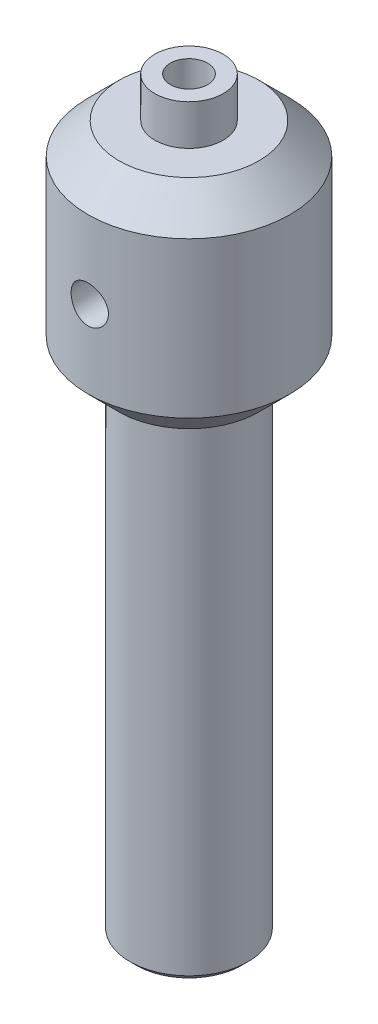
ISO-10303-21;
HEADER;
FILE_DESCRIPTION(('STEP AP214'),'2;1');
FILE_NAME('part.step','',(''),(''),'','','');
FILE_SCHEMA(('AUTOMOTIVE_DESIGN { 1 0 10303 214 1 1 1 1 }'));
ENDSEC;
DATA;
#1=APPLICATION_CONTEXT('core data for automotive mechanical design processes');
#2=APPLICATION_PROTOCOL_DEFINITION('international standard','automotive_design',2000,#1);
#3=PRODUCT_CONTEXT('',#1,'mechanical');
#4=PRODUCT('Part','Part','',(#3));
#5=PRODUCT_RELATED_PRODUCT_CATEGORY('part','',(#4));
#6=PRODUCT_DEFINITION_FORMATION('','',#4);
#7=PRODUCT_DEFINITION_CONTEXT('part definition',#1,'design');
#8=PRODUCT_DEFINITION('design','',#6,#7);
#9=PRODUCT_DEFINITION_SHAPE('','',#8);
#10=(LENGTH_UNIT() NAMED_UNIT(*) SI_UNIT(.MILLI.,.METRE.));
#11=(NAMED_UNIT(*) PLANE_ANGLE_UNIT() SI_UNIT($,.RADIAN.));
#12=(NAMED_UNIT(*) SI_UNIT($,.STERADIAN.) SOLID_ANGLE_UNIT());
#13=UNCERTAINTY_MEASURE_WITH_UNIT(LENGTH_MEASURE(1.E-05),#10,'distance_accuracy_value','');
#14=(GEOMETRIC_REPRESENTATION_CONTEXT(3) GLOBAL_UNCERTAINTY_ASSIGNED_CONTEXT((#13)) GLOBAL_UNIT_ASSIGNED_CONTEXT((#10,
#11,#12)) REPRESENTATION_CONTEXT('',''));
#15=CARTESIAN_POINT('',(0.,0.,0.));
#16=DIRECTION('',(0.,0.,1.));
#17=DIRECTION('',(1.,0.,0.));
#18=AXIS2_PLACEMENT_3D('',#15,#16,#17);
#19=CARTESIAN_POINT('',(11.,240.,0.));
#20=DIRECTION('',(0.,-1.,0.));
#21=DIRECTION('',(1.,0.,0.));
#22=AXIS2_PLACEMENT_3D('',#19,#20,#21);
#23=PLANE('',#22);
#24=CARTESIAN_POINT('',(0.,240.,0.));
#25=DIRECTION('',(0.,1.,0.));
#26=DIRECTION('',(-1.,0.,0.));
#27=AXIS2_PLACEMENT_3D('',#24,#25,#26);
#28=CIRCLE('',#27,11.);
#29=CARTESIAN_POINT('',(-11.,240.,0.));
#30=VERTEX_POINT('',#29);
#31=EDGE_CURVE('E107',#30,#30,#28,.T.);
#32=ORIENTED_EDGE('',*,*,#31,.T.);
#33=EDGE_LOOP('',(#32));
#34=FACE_BOUND('',#33,.T.);
#35=CARTESIAN_POINT('',(0.,240.,0.));
#36=DIRECTION('',(0.,1.,0.));
#37=DIRECTION('',(0.,0.,1.));
#38=AXIS2_PLACEMENT_3D('',#35,#36,#37);
#39=CIRCLE('',#38,6.00000000000001);
#40=CARTESIAN_POINT('',(0.,240.,6.00000000000001));
#41=VERTEX_POINT('',#40);
#42=EDGE_CURVE('E243',#41,#41,#39,.T.);
#43=ORIENTED_EDGE('',*,*,#42,.F.);
#44=EDGE_LOOP('',(#43));
#45=FACE_BOUND('',#44,.T.);
#46=ADVANCED_FACE('F39',(#34,#45),#23,.F.);
#47=CARTESIAN_POINT('',(0.,0.,0.));
#48=DIRECTION('',(0.,1.,0.));
#49=DIRECTION('',(-1.,0.,0.));
#50=AXIS2_PLACEMENT_3D('',#47,#48,#49);
#51=PLANE('',#50);
#52=CARTESIAN_POINT('',(0.,0.,0.));
#53=DIRECTION('',(0.,1.,0.));
#54=DIRECTION('',(-1.,0.,0.));
#55=AXIS2_PLACEMENT_3D('',#52,#53,#54);
#56=CIRCLE('',#55,17.);
#57=CARTESIAN_POINT('',(-17.,0.,0.));
#58=VERTEX_POINT('',#57);
#59=EDGE_CURVE('E10',#58,#58,#56,.F.);
#60=ORIENTED_EDGE('',*,*,#59,.T.);
#61=EDGE_LOOP('',(#60));
#62=FACE_BOUND('',#61,.T.);
#63=ADVANCED_FACE('F84',(#62),#51,.F.);
#64=CARTESIAN_POINT('',(0.,240.,0.));
#65=DIRECTION('',(0.,1.,0.));
#66=DIRECTION('',(-1.,0.,0.));
#67=AXIS2_PLACEMENT_3D('',#64,#65,#66);
#68=CYLINDRICAL_SURFACE('',#67,19.);
#69=CARTESIAN_POINT('',(0.,2.00000000000003,0.));
#70=DIRECTION('',(0.,1.,0.));
#71=DIRECTION('',(-1.,0.,0.));
#72=AXIS2_PLACEMENT_3D('',#69,#70,#71);
#73=CIRCLE('',#72,19.);
#74=CARTESIAN_POINT('',(-19.,2.00000000000003,0.));
#75=VERTEX_POINT('',#74);
#76=EDGE_CURVE('E50',#75,#75,#73,.T.);
#77=ORIENTED_EDGE('',*,*,#76,.T.);
#78=EDGE_LOOP('',(#77));
#79=FACE_BOUND('',#78,.T.);
#80=CARTESIAN_POINT('',(0.,157.,0.));
#81=DIRECTION('',(0.,1.,0.));
#82=DIRECTION('',(-1.,0.,0.));
#83=AXIS2_PLACEMENT_3D('',#80,#81,#82);
#84=CIRCLE('',#83,19.);
#85=CARTESIAN_POINT('',(-19.,157.,0.));
#86=VERTEX_POINT('',#85);
#87=EDGE_CURVE('E110',#86,#86,#84,.T.);
#88=ORIENTED_EDGE('',*,*,#87,.F.);
#89=EDGE_LOOP('',(#88));
#90=FACE_BOUND('',#89,.T.);
#91=ADVANCED_FACE('F147',(#79,#90),#68,.T.);
#92=CARTESIAN_POINT('',(19.,157.,0.));
#93=DIRECTION('',(0.,1.,0.));
#94=DIRECTION('',(-1.,0.,0.));
#95=AXIS2_PLACEMENT_3D('',#92,#93,#94);
#96=PLANE('',#95);
#97=CARTESIAN_POINT('',(0.,157.,0.));
#98=DIRECTION('',(0.,1.,0.));
#99=DIRECTION('',(-1.,0.,0.));
#100=AXIS2_PLACEMENT_3D('',#97,#98,#99);
#101=CIRCLE('',#100,22.5);
#102=CARTESIAN_POINT('',(-22.5,157.,0.));
#103=VERTEX_POINT('',#102);
#104=EDGE_CURVE('E124',#103,#103,#101,.F.);
#105=ORIENTED_EDGE('',*,*,#104,.T.);
#106=EDGE_LOOP('',(#105));
#107=FACE_BOUND('',#106,.T.);
#108=ORIENTED_EDGE('',*,*,#87,.T.);
#109=EDGE_LOOP('',(#108));
#110=FACE_BOUND('',#109,.T.);
#111=ADVANCED_FACE('F100',(#107,#110),#96,.F.);
#112=CARTESIAN_POINT('',(0.,240.,0.));
#113=DIRECTION('',(0.,1.,0.));
#114=DIRECTION('',(-1.,0.,0.));
#115=AXIS2_PLACEMENT_3D('',#112,#113,#114);
#116=CYLINDRICAL_SURFACE('',#115,32.5);
#117=CARTESIAN_POINT('',(0.,198.,-32.5));
#118=CARTESIAN_POINT('',(-0.167047387974428,198.000002951048,-32.5000014014324));
#119=CARTESIAN_POINT('',(-0.334056414535277,197.993021813711,-32.498709777994));
#120=CARTESIAN_POINT('',(-0.666922031200588,197.965157067144,-32.4935823968579));
#121=CARTESIAN_POINT('',(-0.832778404858191,197.944270914476,-32.4897461737147));
#122=CARTESIAN_POINT('',(-1.16218709311426,197.888738536972,-32.4796320956753));
#123=CARTESIAN_POINT('',(-1.32573803450886,197.854084442608,-32.4733528444273));
#124=CARTESIAN_POINT('',(-1.64934345668917,197.771271041131,-32.4585259988949));
#125=CARTESIAN_POINT('',(-1.80939663010091,197.72310677428,-32.449977571632));
#126=CARTESIAN_POINT('',(-2.12461909376537,197.613714664144,-32.4308633624608));
#127=CARTESIAN_POINT('',(-2.27979434281075,197.552503531732,-32.4203001629444));
#128=CARTESIAN_POINT('',(-2.58446206954016,197.417410303793,-32.3974366809218));
#129=CARTESIAN_POINT('',(-2.73395242740516,197.34352353721,-32.3851357583491));
#130=CARTESIAN_POINT('',(-3.02610605021081,197.1836663224,-32.3591437290318));
#131=CARTESIAN_POINT('',(-3.16877249289802,197.097701573525,-32.3454532788178));
#132=CARTESIAN_POINT('',(-3.44644953798866,196.914233178875,-32.3170461894859));
#133=CARTESIAN_POINT('',(-3.58145726002221,196.816725233819,-32.3023291688641));
#134=CARTESIAN_POINT('',(-3.84417623264326,196.609831402662,-32.2721237443792));
#135=CARTESIAN_POINT('',(-3.97180053780938,196.500336011848,-32.2566290755318));
#136=CARTESIAN_POINT('',(-4.21744501771729,196.27099554245,-32.2254324395731));
#137=CARTESIAN_POINT('',(-4.33546161754138,196.151146645324,-32.2097303978037));
#138=CARTESIAN_POINT('',(-4.56100087376238,195.901986604755,-32.1785678807607));
#139=CARTESIAN_POINT('',(-4.6685266280766,195.772678274512,-32.1631073353135));
#140=CARTESIAN_POINT('',(-4.87241936155106,195.505394933914,-32.1328517105623));
#141=CARTESIAN_POINT('',(-4.96878221059233,195.36741674477,-32.1180568787931));
#142=CARTESIAN_POINT('',(-5.15028638072953,195.082734596099,-32.0894539852934));
#143=CARTESIAN_POINT('',(-5.23534055334006,194.935974240216,-32.0756539245591));
#144=CARTESIAN_POINT('',(-5.39279796033514,194.635620840363,-32.0495569658406));
#145=CARTESIAN_POINT('',(-5.46519645843934,194.482025265232,-32.0372606311283));
#146=CARTESIAN_POINT('',(-5.59673049546196,194.169186629211,-32.0145447471987));
#147=CARTESIAN_POINT('',(-5.65587180506683,194.00994606061,-32.0041243817861));
#148=CARTESIAN_POINT('',(-5.76049139817702,193.68689735635,-31.9854579827382));
#149=CARTESIAN_POINT('',(-5.80596470935165,193.523087582069,-31.977212740532));
#150=CARTESIAN_POINT('',(-5.92036897645241,193.030409159429,-31.9563064605375));
#151=CARTESIAN_POINT('',(-5.96891901071692,192.696386732529,-31.9471824578801));
#152=CARTESIAN_POINT('',(-6.00937773039182,192.025005778692,-31.9395955731685));
#153=CARTESIAN_POINT('',(-6.00129133836949,191.687647544233,-31.9411317645811));
#154=CARTESIAN_POINT('',(-5.92929348899847,191.023490395548,-31.9545734655921));
#155=CARTESIAN_POINT('',(-5.8660952196025,190.696611688162,-31.9663464973696));
#156=CARTESIAN_POINT('',(-5.68676990030918,190.058190702375,-31.9987323168555));
#157=CARTESIAN_POINT('',(-5.57064066366297,189.746649058187,-32.0193454697757));
#158=CARTESIAN_POINT('',(-5.28805391152013,189.145635615852,-32.0672268492818));
#159=CARTESIAN_POINT('',(-5.12130716064855,188.856302952439,-32.0945331440214));
#160=CARTESIAN_POINT('',(-4.74242193954203,188.30945617947,-32.1526990787035));
#161=CARTESIAN_POINT('',(-4.53027899873101,188.051945207629,-32.1835590684724));
#162=CARTESIAN_POINT('',(-4.06277153030441,187.571927527527,-32.2459333357088));
#163=CARTESIAN_POINT('',(-3.80679653324245,187.350015311049,-32.2774504088927));
#164=CARTESIAN_POINT('',(-3.26093695329242,186.952194045544,-32.3371543132373));
#165=CARTESIAN_POINT('',(-2.97105204985809,186.776285431433,-32.3653411129122));
#166=CARTESIAN_POINT('',(-2.36499021324983,186.475381996096,-32.4152628733547));
#167=CARTESIAN_POINT('',(-2.04878258243287,186.350447651793,-32.4369901621846));
#168=CARTESIAN_POINT('',(-1.39937919492226,186.155633070481,-32.4714852504939));
#169=CARTESIAN_POINT('',(-1.06618519067573,186.085747166433,-32.4842539722107));
#170=CARTESIAN_POINT('',(-0.397383215203513,186.003837604151,-32.4992669465579));
#171=CARTESIAN_POINT('',(-0.0618782483745631,185.990999171889,-32.5016593853383));
#172=CARTESIAN_POINT('',(0.60648490966126,186.021365382145,-32.496059063738));
#173=CARTESIAN_POINT('',(0.939343226021664,186.064567358601,-32.4880667973981));
#174=CARTESIAN_POINT('',(1.59038992422882,186.205110554301,-32.4626872786007));
#175=CARTESIAN_POINT('',(1.9086700501083,186.302040788101,-32.4453713741909));
#176=CARTESIAN_POINT('',(2.52446187534884,186.546845306371,-32.4032781211013));
#177=CARTESIAN_POINT('',(2.82197219688194,186.694722966739,-32.3785002779894));
#178=CARTESIAN_POINT('',(3.39126548533967,187.039036730946,-32.3238620342218));
#179=CARTESIAN_POINT('',(3.66274135122632,187.235972303467,-32.2939504055837));
#180=CARTESIAN_POINT('',(4.16908432952835,187.672135346245,-32.2324977111764));
#181=CARTESIAN_POINT('',(4.40394813141741,187.911366636785,-32.2009564984005));
#182=CARTESIAN_POINT('',(4.83348551479757,188.429009489889,-32.1393095123828));
#183=CARTESIAN_POINT('',(5.02760384169285,188.707885037177,-32.1092273941104));
#184=CARTESIAN_POINT('',(5.3662384165949,189.29477862801,-32.0543763326784));
#185=CARTESIAN_POINT('',(5.51075647264597,189.602795608759,-32.0296071958606));
#186=CARTESIAN_POINT('',(5.74529998594315,190.237733868761,-31.9883683472532));
#187=CARTESIAN_POINT('',(5.83558308225323,190.564557555855,-31.9718594593372));
#188=CARTESIAN_POINT('',(5.95987109852569,191.229255527096,-31.9489294956881));
#189=CARTESIAN_POINT('',(5.99388215230629,191.567128602734,-31.9425073204774));
#190=CARTESIAN_POINT('',(6.00189486714628,192.071678138939,-31.9409937887347));
#191=CARTESIAN_POINT('',(5.99758283494898,192.238274119685,-31.9418077558083));
#192=CARTESIAN_POINT('',(5.97513253775215,192.570482113081,-31.9460164877229));
#193=CARTESIAN_POINT('',(5.95699949373228,192.736094473498,-31.949410278017));
#194=CARTESIAN_POINT('',(5.90703362997939,193.065215620486,-31.9586855963114));
#195=CARTESIAN_POINT('',(5.87519596756222,193.228723642411,-31.9645680036805));
#196=CARTESIAN_POINT('',(5.79808429743151,193.552378272652,-31.978645302017));
#197=CARTESIAN_POINT('',(5.75281510317847,193.712526063197,-31.9868393645045));
#198=CARTESIAN_POINT('',(5.64925240533489,194.028176622226,-32.0052918435401));
#199=CARTESIAN_POINT('',(5.59097742811478,194.183685644782,-32.0155473216154));
#200=CARTESIAN_POINT('',(5.46182056358104,194.489178204963,-32.0378339830431));
#201=CARTESIAN_POINT('',(5.39094316290593,194.63916368618,-32.0498645341861));
#202=CARTESIAN_POINT('',(5.23704527717768,194.932717658784,-32.0753712303172));
#203=CARTESIAN_POINT('',(5.15401988366897,195.076283525534,-32.0888479590508));
#204=CARTESIAN_POINT('',(4.97646002457539,195.35593046589,-32.1168634444833));
#205=CARTESIAN_POINT('',(4.88192955508216,195.492014114611,-32.1314018317354));
#206=CARTESIAN_POINT('',(4.68049098336986,195.757821711608,-32.1613669342854));
#207=CARTESIAN_POINT('',(4.5734194828492,195.887420733857,-32.1768036560179));
#208=CARTESIAN_POINT('',(4.34884138360292,196.137120438952,-32.2079248208257));
#209=CARTESIAN_POINT('',(4.23133849380695,196.257224469299,-32.2236091742366));
#210=CARTESIAN_POINT('',(3.98659111868756,196.487238515557,-32.2548029719054));
#211=CARTESIAN_POINT('',(3.85934088957486,196.597142435201,-32.2703123067585));
#212=CARTESIAN_POINT('',(3.59607102507714,196.805880120683,-32.3007093143119));
#213=CARTESIAN_POINT('',(3.46005463969103,196.904717952427,-32.3155972140706));
#214=CARTESIAN_POINT('',(3.17885786431137,197.091523494682,-32.3444742543555));
#215=CARTESIAN_POINT('',(3.03360543194254,197.179384266206,-32.3584539984354));
#216=CARTESIAN_POINT('',(2.73613292684858,197.342503362624,-32.384963576446));
#217=CARTESIAN_POINT('',(2.58391544613777,197.417766327943,-32.3974939437296));
#218=CARTESIAN_POINT('',(2.2736282522865,197.555121589046,-32.4207463085123));
#219=CARTESIAN_POINT('',(2.11556241225015,197.617222424426,-32.4314694775916));
#220=CARTESIAN_POINT('',(1.79467228319849,197.727823393983,-32.4508090321666));
#221=CARTESIAN_POINT('',(1.63184896912174,197.776326293468,-32.4594258459698));
#222=CARTESIAN_POINT('',(1.22783758338941,197.878204607649,-32.4776798969895));
#223=CARTESIAN_POINT('',(0.984588736194148,197.923819554013,-32.4860086220749));
#224=CARTESIAN_POINT('',(0.494198560196129,197.984714702236,-32.4971675709575));
#225=CARTESIAN_POINT('',(0.24705732539044,197.999995635502,-32.4999979273299));
#226=CARTESIAN_POINT('',(0.,198.,-32.5));
#227=B_SPLINE_CURVE_WITH_KNOTS('',3,(#117,#118,#119,#120,#121,#122,#123,#124,#125,#126,#127,
#128,#129,#130,#131,#132,#133,#134,#135,#136,#137,#138,#139,#140,#141,#142,#143,#144,#145,#146,
#147,#148,#149,#150,#151,#152,#153,#154,#155,#156,#157,#158,#159,#160,#161,#162,#163,#164,#165,
#166,#167,#168,#169,#170,#171,#172,#173,#174,#175,#176,#177,#178,#179,#180,#181,#182,#183,#184,
#185,#186,#187,#188,#189,#190,#191,#192,#193,#194,#195,#196,#197,#198,#199,#200,#201,#202,#203,
#204,#205,#206,#207,#208,#209,#210,#211,#212,#213,#214,#215,#216,#217,#218,#219,#220,#221,#222,
#223,#224,#225,#226),.UNSPECIFIED.,.T.,.F.,(4,2,2,2,2,2,2,2,2,2,2,2,2,2,2,2,2,2,2,2,2,2,2,2,2,2,
2,2,2,2,2,2,2,2,2,2,2,2,2,2,2,2,2,2,2,2,2,2,2,2,2,2,2,2,4),(0.,0.500925415856104,
1.00194248373588,1.50324633759921,2.00473446721871,2.50558409263794,3.00661868254916,
3.50741763369359,4.00840369848706,4.51442366052908,5.02063105435907,5.52668851124021,
6.03293260831374,6.54287614170782,7.05301011052263,7.56292159140477,8.07301835093452,
9.08064758459464,10.088189241028,11.0828828743722,12.0776176054417,13.0781469402784,
14.0787748517292,15.0946807664379,16.1105962851585,17.1277136264852,18.144726245551,
19.147165819545,20.1495577053301,21.1443857119725,22.1392796509597,23.1447493595254,
24.1503099317355,25.1687925873859,26.1872381130497,27.2008065243771,28.2142644464847,
28.7137382676778,29.2130235027488,29.7124853110036,30.2117683427893,30.7103446486533,
31.2087438085096,31.7073449079497,32.2057733184101,32.711626137455,33.2172998130326,
33.7232737924587,34.2290612523622,34.7394448349454,35.2496400010553,35.7595031320703,
36.2692625008281,37.0101317779487,37.7509831912043),.UNSPECIFIED.);
#228=CARTESIAN_POINT('',(0.,198.,-32.5));
#229=VERTEX_POINT('',#228);
#230=EDGE_CURVE('E51',#229,#229,#227,.T.);
#231=ORIENTED_EDGE('',*,*,#230,.T.);
#232=EDGE_LOOP('',(#231));
#233=FACE_BOUND('',#232,.T.);
#234=CARTESIAN_POINT('',(5.99999999999999,192.,31.9413525073689));
#235=CARTESIAN_POINT('',(6.00000295853528,191.83297989422,31.9413510155267));
#236=CARTESIAN_POINT('',(5.99302407715923,191.665998157171,31.9426650102768));
#237=CARTESIAN_POINT('',(5.96516856930216,191.333187861383,31.9478791151135));
#238=CARTESIAN_POINT('',(5.94428939706711,191.167359519503,31.9517796989175));
#239=CARTESIAN_POINT('',(5.88877610738074,190.838007485795,31.962057306545));
#240=CARTESIAN_POINT('',(5.85413407949496,190.674485175466,31.9684357545159));
#241=CARTESIAN_POINT('',(5.77135045100128,190.350937638816,31.9834845406126));
#242=CARTESIAN_POINT('',(5.7232038872311,190.19091372157,31.9921557212921));
#243=CARTESIAN_POINT('',(5.6138545220662,189.875753509853,32.0115246934935));
#244=CARTESIAN_POINT('',(5.55266878540923,189.720611128433,32.0222198341718));
#245=CARTESIAN_POINT('',(5.41763251250717,189.416006361743,32.0453420785026));
#246=CARTESIAN_POINT('',(5.34377730623472,189.266546095834,32.0577698204828));
#247=CARTESIAN_POINT('',(5.18398806674357,188.974447370286,32.0839962627161));
#248=CARTESIAN_POINT('',(5.0980597003427,188.831805752015,32.0977943188948));
#249=CARTESIAN_POINT('',(4.91466745622353,188.554171652589,32.1263856672193));
#250=CARTESIAN_POINT('',(4.81719927981945,188.419182049746,32.1411793293463));
#251=CARTESIAN_POINT('',(4.61034548396162,188.156439003795,32.171505273518));
#252=CARTESIAN_POINT('',(4.50084597428908,188.028775916408,32.1870436584928));
#253=CARTESIAN_POINT('',(4.27148905640612,187.783053462911,32.2182832804324));
#254=CARTESIAN_POINT('',(4.15162782612185,187.664997672036,32.2339845755935));
#255=CARTESIAN_POINT('',(3.90243530466567,187.439381658887,32.2651012097674));
#256=CARTESIAN_POINT('',(3.77310687922166,187.331818283358,32.2805166335572));
#257=CARTESIAN_POINT('',(3.50577559302648,187.127853108078,32.3106427456994));
#258=CARTESIAN_POINT('',(3.3677695526625,187.031455436819,32.3253531722095));
#259=CARTESIAN_POINT('',(3.08306471017445,186.849911321549,32.3537527138724));
#260=CARTESIAN_POINT('',(2.93631162303766,186.764848728913,32.3674339230622));
#261=CARTESIAN_POINT('',(2.63597199364872,186.60737373752,32.3932768150282));
#262=CARTESIAN_POINT('',(2.48238292019938,186.534966074292,32.405437928495));
#263=CARTESIAN_POINT('',(2.16955749285644,186.403413320498,32.4278825976848));
#264=CARTESIAN_POINT('',(2.01032361299019,186.344262500907,32.4381669640968));
#265=CARTESIAN_POINT('',(1.68728985940886,186.239623683673,32.4565759252547));
#266=CARTESIAN_POINT('',(1.52348834648177,186.194140661861,32.4646997333148));
#267=CARTESIAN_POINT('',(1.03085331580678,186.079709968468,32.4852880303493));
#268=CARTESIAN_POINT('',(0.696870045496276,186.03113957446,32.4942588120657));
#269=CARTESIAN_POINT('',(0.0255664198837205,185.990626602143,32.5017263371873));
#270=CARTESIAN_POINT('',(-0.311753657266865,185.998679342876,32.5002239463956));
#271=CARTESIAN_POINT('',(-0.976054278284218,186.070622073137,32.4870176310848));
#272=CARTESIAN_POINT('',(-1.30311063675734,186.133832835072,32.4754378068713));
#273=CARTESIAN_POINT('',(-1.9418803823515,186.313244015841,32.4435119174272));
#274=CARTESIAN_POINT('',(-2.25359322258674,186.429446321929,32.4231655399838));
#275=CARTESIAN_POINT('',(-2.85482127182887,186.712188024522,32.3757858792464));
#276=CARTESIAN_POINT('',(-3.14420524520472,186.87900022254,32.3487165042421));
#277=CARTESIAN_POINT('',(-3.69112726413708,187.258027127602,32.2908861364092));
#278=CARTESIAN_POINT('',(-3.94866216241416,187.470246316051,32.2601247793352));
#279=CARTESIAN_POINT('',(-4.42860067861484,187.937810285034,32.1977799600073));
#280=CARTESIAN_POINT('',(-4.65042497033575,188.193749399587,32.1661910748591));
#281=CARTESIAN_POINT('',(-5.04808559706015,188.739505042936,32.1061894073334));
#282=CARTESIAN_POINT('',(-5.22392129912476,189.029322037914,32.0777766686721));
#283=CARTESIAN_POINT('',(-5.52477115699436,189.635360658923,32.0273370970673));
#284=CARTESIAN_POINT('',(-5.6497032253674,189.951623950477,32.0053205950001));
#285=CARTESIAN_POINT('',(-5.84449643174314,190.601149011912,31.9703261346544));
#286=CARTESIAN_POINT('',(-5.91436360464892,190.934408914765,31.9573471859125));
#287=CARTESIAN_POINT('',(-5.99620229168365,191.603248984161,31.9420927158332));
#288=CARTESIAN_POINT('',(-6.00900518397557,191.938724022503,31.9396635072359));
#289=CARTESIAN_POINT('',(-5.97857858316262,192.607018981799,31.9453725765504));
#290=CARTESIAN_POINT('',(-5.93535177193746,192.939839029068,31.9535103486704));
#291=CARTESIAN_POINT('',(-5.7948058614251,193.590656708489,31.979293465026));
#292=CARTESIAN_POINT('',(-5.69792075735499,193.908751357516,31.9968624934417));
#293=CARTESIAN_POINT('',(-5.45326809850268,194.524192033041,32.0394630353324));
#294=CARTESIAN_POINT('',(-5.30549689375589,194.821536569332,32.0644950840986));
#295=CARTESIAN_POINT('',(-4.96134651750515,195.390704585835,32.1195522144905));
#296=CARTESIAN_POINT('',(-4.76444105467973,195.662204633957,32.1496301190139));
#297=CARTESIAN_POINT('',(-4.32832188526402,196.168610273872,32.2112404635557));
#298=CARTESIAN_POINT('',(-4.08910449593804,196.403512676938,32.2427730300079));
#299=CARTESIAN_POINT('',(-3.57144762775754,196.833151201588,32.3042327039953));
#300=CARTESIAN_POINT('',(-3.29254111714156,197.027328863827,32.3341337897012));
#301=CARTESIAN_POINT('',(-2.70556807005945,197.366067413695,32.3885259688709));
#302=CARTESIAN_POINT('',(-2.39750263248846,197.510630170182,32.4130172660944));
#303=CARTESIAN_POINT('',(-1.76258072681931,197.745199822415,32.453720812997));
#304=CARTESIAN_POINT('',(-1.43582908021702,197.835483549529,32.4699750052543));
#305=CARTESIAN_POINT('',(-0.77128467597165,197.959797240176,32.4925422562138));
#306=CARTESIAN_POINT('',(-0.433493046619101,197.99383293406,32.4988563275774));
#307=CARTESIAN_POINT('',(0.0710321096354684,198.001904015121,32.5003540565631));
#308=CARTESIAN_POINT('',(0.237682638844506,197.997607810255,32.4995572690841));
#309=CARTESIAN_POINT('',(0.570001473574015,197.975179935889,32.495424432952));
#310=CARTESIAN_POINT('',(0.735670126050046,197.957053488514,32.4920893427311));
#311=CARTESIAN_POINT('',(1.06490505616124,197.907091193183,32.4829668638016));
#312=CARTESIAN_POINT('',(1.22847057559064,197.875250536315,32.4771786148998));
#313=CARTESIAN_POINT('',(1.55224085017752,197.798122753943,32.4633144843585));
#314=CARTESIAN_POINT('',(1.71244678909535,197.752840452875,32.4552394235427));
#315=CARTESIAN_POINT('',(2.02822736208987,197.649236416606,32.4370355937856));
#316=CARTESIAN_POINT('',(2.18380784113106,197.590932006085,32.4269095551275));
#317=CARTESIAN_POINT('',(2.48943892302123,197.461704090559,32.4048786716608));
#318=CARTESIAN_POINT('',(2.63949147339191,197.390785082078,32.3929744609304));
#319=CARTESIAN_POINT('',(2.93317210590938,197.236793223293,32.3677035827214));
#320=CARTESIAN_POINT('',(3.07679757825832,197.153715493224,32.3543363286126));
#321=CARTESIAN_POINT('',(3.35655401432147,196.976042020611,32.326510815552));
#322=CARTESIAN_POINT('',(3.49268756010241,196.881450282889,32.3120529366049));
#323=CARTESIAN_POINT('',(3.75850222746006,196.67994356101,32.2822211930688));
#324=CARTESIAN_POINT('',(3.88806348648544,196.572871925438,32.2668371982912));
#325=CARTESIAN_POINT('',(4.13768673508277,196.348301393365,32.2357777361537));
#326=CARTESIAN_POINT('',(4.2577520724429,196.230806202964,32.2201023739441));
#327=CARTESIAN_POINT('',(4.48768949162612,195.986082007245,32.1888818740741));
#328=CARTESIAN_POINT('',(4.59755543208624,195.858847220468,32.1733368199346));
#329=CARTESIAN_POINT('',(4.80621920583968,195.59561604409,32.1428277311297));
#330=CARTESIAN_POINT('',(4.90502109816958,195.459622896676,32.1278634847102));
#331=CARTESIAN_POINT('',(5.09178042683272,195.178446227386,32.0987973355249));
#332=CARTESIAN_POINT('',(5.17962815718121,195.033188835856,32.0847047744441));
#333=CARTESIAN_POINT('',(5.34272083193665,194.735708091099,32.0579500798171));
#334=CARTESIAN_POINT('',(5.41797041710959,194.583487329389,32.0452874201017));
#335=CARTESIAN_POINT('',(5.55529909721154,194.273194272944,32.0217661734498));
#336=CARTESIAN_POINT('',(5.61738677931813,194.115125872932,32.0109064112641));
#337=CARTESIAN_POINT('',(5.72796202752484,193.794229629749,31.9913049603576));
#338=CARTESIAN_POINT('',(5.77645236729059,193.63140276473,31.9825628397174));
#339=CARTESIAN_POINT('',(5.8782797015625,193.227461583055,31.9640370171761));
#340=CARTESIAN_POINT('',(5.92386631533028,192.984288196084,31.9555746068073));
#341=CARTESIAN_POINT('',(5.98472388662139,192.494048505158,31.9442335268559));
#342=CARTESIAN_POINT('',(5.99999562504255,192.246982301647,31.9413547134423));
#343=CARTESIAN_POINT('',(5.99999999999999,192.,31.9413525073689));
#344=B_SPLINE_CURVE_WITH_KNOTS('',3,(#234,#235,#236,#237,#238,#239,#240,#241,#242,#243,#244,
#245,#246,#247,#248,#249,#250,#251,#252,#253,#254,#255,#256,#257,#258,#259,#260,#261,#262,#263,
#264,#265,#266,#267,#268,#269,#270,#271,#272,#273,#274,#275,#276,#277,#278,#279,#280,#281,#282,
#283,#284,#285,#286,#287,#288,#289,#290,#291,#292,#293,#294,#295,#296,#297,#298,#299,#300,#301,
#302,#303,#304,#305,#306,#307,#308,#309,#310,#311,#312,#313,#314,#315,#316,#317,#318,#319,#320,
#321,#322,#323,#324,#325,#326,#327,#328,#329,#330,#331,#332,#333,#334,#335,#336,#337,#338,#339,
#340,#341,#342,#343),.UNSPECIFIED.,.T.,.F.,(4,2,2,2,2,2,2,2,2,2,2,2,2,2,2,2,2,2,2,2,2,2,2,2,2,2,
2,2,2,2,2,2,2,2,2,2,2,2,2,2,2,2,2,2,2,2,2,2,2,2,2,2,2,2,4),(0.,0.500843463331355,
1.00177867835027,1.50300223188229,2.00441023608585,2.50516601956036,3.00610678220385,
3.50681319732148,4.00770672054381,4.51383441416539,5.02014960364327,5.52631215984353,
6.03266127501115,6.54256967053901,7.05266846938638,7.56254639910265,8.07260972824404,
9.08012563787736,10.087558258518,11.082757472296,12.0779921321037,13.0786896815496,
14.0794860395937,15.0951637423725,16.1108554231421,17.128178591491,18.1453902495802,
19.1477325069965,20.1500267887514,21.144330335666,22.1387052169704,23.1442262843942,
24.1498349132333,25.1684425209453,26.1870117562707,27.2003410634462,28.2135671298398,
28.7132031034217,29.2126505140953,29.7122731996682,30.2117167784932,30.7104998117236,
31.2091054067347,31.7079116630686,32.2065449168668,32.7122968113089,33.217869600612,
33.7237448623405,34.2294339227625,34.7398381371698,35.2500539188164,35.7599357905254,
36.2697135777541,37.010358887058,37.7509851174174),.UNSPECIFIED.);
#345=CARTESIAN_POINT('',(5.99999999999999,192.,31.9413525073689));
#346=VERTEX_POINT('',#345);
#347=EDGE_CURVE('E54',#346,#346,#344,.T.);
#348=ORIENTED_EDGE('',*,*,#347,.T.);
#349=EDGE_LOOP('',(#348));
#350=FACE_BOUND('',#349,.T.);
#351=CARTESIAN_POINT('',(0.,167.,0.));
#352=DIRECTION('',(0.,1.,0.));
#353=DIRECTION('',(-1.,0.,0.));
#354=AXIS2_PLACEMENT_3D('',#351,#352,#353);
#355=CIRCLE('',#354,32.5);
#356=CARTESIAN_POINT('',(-32.5,167.,0.));
#357=VERTEX_POINT('',#356);
#358=EDGE_CURVE('E117',#357,#357,#355,.T.);
#359=ORIENTED_EDGE('',*,*,#358,.T.);
#360=EDGE_LOOP('',(#359));
#361=FACE_BOUND('',#360,.T.);
#362=CARTESIAN_POINT('',(0.,217.,0.));
#363=DIRECTION('',(0.,-1.,0.));
#364=DIRECTION('',(1.,0.,0.));
#365=AXIS2_PLACEMENT_3D('',#362,#363,#364);
#366=CIRCLE('',#365,32.5);
#367=CARTESIAN_POINT('',(32.5,217.,0.));
#368=VERTEX_POINT('',#367);
#369=EDGE_CURVE('E112',#368,#368,#366,.T.);
#370=ORIENTED_EDGE('',*,*,#369,.T.);
#371=EDGE_LOOP('',(#370));
#372=FACE_BOUND('',#371,.T.);
#373=ADVANCED_FACE('F70',(#233,#350,#361,#372),#116,.T.);
#374=CARTESIAN_POINT('',(32.5,227.,0.));
#375=DIRECTION('',(0.,-1.,0.));
#376=DIRECTION('',(1.,0.,0.));
#377=AXIS2_PLACEMENT_3D('',#374,#375,#376);
#378=PLANE('',#377);
#379=CARTESIAN_POINT('',(0.,227.,0.));
#380=DIRECTION('',(0.,-1.,0.));
#381=DIRECTION('',(1.,0.,0.));
#382=AXIS2_PLACEMENT_3D('',#379,#380,#381);
#383=CIRCLE('',#382,22.5);
#384=CARTESIAN_POINT('',(22.5,227.,0.));
#385=VERTEX_POINT('',#384);
#386=EDGE_CURVE('E105',#385,#385,#383,.F.);
#387=ORIENTED_EDGE('',*,*,#386,.T.);
#388=EDGE_LOOP('',(#387));
#389=FACE_BOUND('',#388,.T.);
#390=CARTESIAN_POINT('',(0.,227.,0.));
#391=DIRECTION('',(0.,1.,0.));
#392=DIRECTION('',(-1.,0.,0.));
#393=AXIS2_PLACEMENT_3D('',#390,#391,#392);
#394=CIRCLE('',#393,11.);
#395=CARTESIAN_POINT('',(-11.,227.,0.));
#396=VERTEX_POINT('',#395);
#397=EDGE_CURVE('E104',#396,#396,#394,.T.);
#398=ORIENTED_EDGE('',*,*,#397,.F.);
#399=EDGE_LOOP('',(#398));
#400=FACE_BOUND('',#399,.T.);
#401=ADVANCED_FACE('F86',(#389,#400),#378,.F.);
#402=CARTESIAN_POINT('',(0.,240.,0.));
#403=DIRECTION('',(0.,1.,0.));
#404=DIRECTION('',(-1.,0.,0.));
#405=AXIS2_PLACEMENT_3D('',#402,#403,#404);
#406=CYLINDRICAL_SURFACE('',#405,11.);
#407=ORIENTED_EDGE('',*,*,#31,.F.);
#408=EDGE_LOOP('',(#407));
#409=FACE_BOUND('',#408,.T.);
#410=ORIENTED_EDGE('',*,*,#397,.T.);
#411=EDGE_LOOP('',(#410));
#412=FACE_BOUND('',#411,.T.);
#413=ADVANCED_FACE('F83',(#409,#412),#406,.T.);
#414=CARTESIAN_POINT('',(0.,167.,0.));
#415=DIRECTION('',(0.,1.,0.));
#416=DIRECTION('',(-1.,0.,0.));
#417=AXIS2_PLACEMENT_3D('',#414,#415,#416);
#418=CONICAL_SURFACE('',#417,32.5,0.78539816339745);
#419=ORIENTED_EDGE('',*,*,#104,.F.);
#420=EDGE_LOOP('',(#419));
#421=FACE_BOUND('',#420,.T.);
#422=ORIENTED_EDGE('',*,*,#358,.F.);
#423=EDGE_LOOP('',(#422));
#424=FACE_BOUND('',#423,.T.);
#425=ADVANCED_FACE('F87',(#421,#424),#418,.T.);
#426=CARTESIAN_POINT('',(0.,227.,0.));
#427=DIRECTION('',(0.,-1.,0.));
#428=DIRECTION('',(1.,0.,0.));
#429=AXIS2_PLACEMENT_3D('',#426,#427,#428);
#430=CONICAL_SURFACE('',#429,22.5,0.785398163397447);
#431=ORIENTED_EDGE('',*,*,#369,.F.);
#432=EDGE_LOOP('',(#431));
#433=FACE_BOUND('',#432,.T.);
#434=ORIENTED_EDGE('',*,*,#386,.F.);
#435=EDGE_LOOP('',(#434));
#436=FACE_BOUND('',#435,.T.);
#437=ADVANCED_FACE('F76',(#433,#436),#430,.T.);
#438=CARTESIAN_POINT('',(0.,192.,-32.5));
#439=DIRECTION('',(0.,0.,1.));
#440=DIRECTION('',(1.,0.,0.));
#441=AXIS2_PLACEMENT_3D('',#438,#439,#440);
#442=CYLINDRICAL_SURFACE('',#441,6.);
#443=ORIENTED_EDGE('',*,*,#347,.F.);
#444=EDGE_LOOP('',(#443));
#445=FACE_BOUND('',#444,.T.);
#446=ORIENTED_EDGE('',*,*,#230,.F.);
#447=EDGE_LOOP('',(#446));
#448=FACE_BOUND('',#447,.T.);
#449=ADVANCED_FACE('F72',(#445,#448),#442,.F.);
#450=CARTESIAN_POINT('',(0.,217.,0.));
#451=DIRECTION('',(0.,-1.,0.));
#452=DIRECTION('',(0.,0.,-1.));
#453=AXIS2_PLACEMENT_3D('',#450,#451,#452);
#454=PLANE('',#453);
#455=CARTESIAN_POINT('',(0.,217.,0.));
#456=DIRECTION('',(0.,1.,0.));
#457=DIRECTION('',(0.,0.,1.));
#458=AXIS2_PLACEMENT_3D('',#455,#456,#457);
#459=CIRCLE('',#458,6.00000000000001);
#460=CARTESIAN_POINT('',(0.,217.,6.00000000000001));
#461=VERTEX_POINT('',#460);
#462=EDGE_CURVE('E111',#461,#461,#459,.T.);
#463=ORIENTED_EDGE('',*,*,#462,.T.);
#464=EDGE_LOOP('',(#463));
#465=FACE_BOUND('',#464,.T.);
#466=ADVANCED_FACE('F79',(#465),#454,.F.);
#467=CARTESIAN_POINT('',(0.,240.,0.));
#468=DIRECTION('',(0.,1.,0.));
#469=DIRECTION('',(0.,0.,1.));
#470=AXIS2_PLACEMENT_3D('',#467,#468,#469);
#471=CYLINDRICAL_SURFACE('',#470,6.00000000000001);
#472=ORIENTED_EDGE('',*,*,#462,.F.);
#473=EDGE_LOOP('',(#472));
#474=FACE_BOUND('',#473,.T.);
#475=ORIENTED_EDGE('',*,*,#42,.T.);
#476=EDGE_LOOP('',(#475));
#477=FACE_BOUND('',#476,.T.);
#478=ADVANCED_FACE('F203',(#474,#477),#471,.F.);
#479=CARTESIAN_POINT('',(0.,2.00000000000003,0.));
#480=DIRECTION('',(0.,1.,0.));
#481=DIRECTION('',(-1.,0.,0.));
#482=AXIS2_PLACEMENT_3D('',#479,#480,#481);
#483=CONICAL_SURFACE('',#482,19.,0.785398163397445);
#484=ORIENTED_EDGE('',*,*,#59,.F.);
#485=EDGE_LOOP('',(#484));
#486=FACE_BOUND('',#485,.T.);
#487=ORIENTED_EDGE('',*,*,#76,.F.);
#488=EDGE_LOOP('',(#487));
#489=FACE_BOUND('',#488,.T.);
#490=ADVANCED_FACE('F45',(#486,#489),#483,.T.);
#491=CLOSED_SHELL('',(#46,#63,#91,#111,#373,#401,#413,#425,#437,#449,#466,#478,#490));
#492=MANIFOLD_SOLID_BREP('B2',#491);
#493=ADVANCED_BREP_SHAPE_REPRESENTATION('',(#18,#492),#14);
#494=SHAPE_DEFINITION_REPRESENTATION(#9,#493);
ENDSEC;
END-ISO-10303-21;
